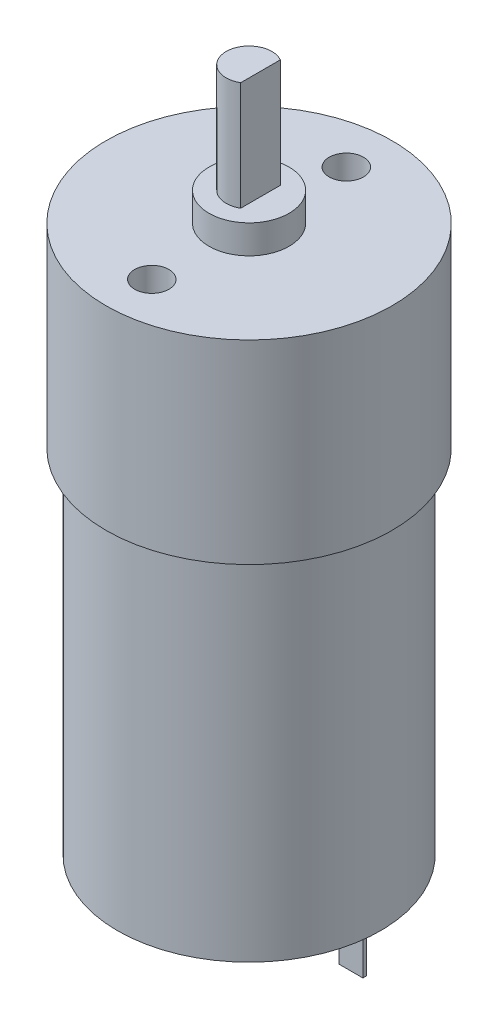
ISO-10303-21;
HEADER;
FILE_DESCRIPTION(('STEP AP214'),'2;1');
FILE_NAME('part.step','',(''),(''),'','','');
FILE_SCHEMA(('AUTOMOTIVE_DESIGN { 1 0 10303 214 1 1 1 1 }'));
ENDSEC;
DATA;
#1=APPLICATION_CONTEXT('core data for automotive mechanical design processes');
#2=APPLICATION_PROTOCOL_DEFINITION('international standard','automotive_design',2000,#1);
#3=PRODUCT_CONTEXT('',#1,'mechanical');
#4=PRODUCT('Part','Part','',(#3));
#5=PRODUCT_RELATED_PRODUCT_CATEGORY('part','',(#4));
#6=PRODUCT_DEFINITION_FORMATION('','',#4);
#7=PRODUCT_DEFINITION_CONTEXT('part definition',#1,'design');
#8=PRODUCT_DEFINITION('design','',#6,#7);
#9=PRODUCT_DEFINITION_SHAPE('','',#8);
#10=(LENGTH_UNIT() NAMED_UNIT(*) SI_UNIT(.MILLI.,.METRE.));
#11=(NAMED_UNIT(*) PLANE_ANGLE_UNIT() SI_UNIT($,.RADIAN.));
#12=(NAMED_UNIT(*) SI_UNIT($,.STERADIAN.) SOLID_ANGLE_UNIT());
#13=UNCERTAINTY_MEASURE_WITH_UNIT(LENGTH_MEASURE(1.E-05),#10,'distance_accuracy_value','');
#14=(GEOMETRIC_REPRESENTATION_CONTEXT(3) GLOBAL_UNCERTAINTY_ASSIGNED_CONTEXT((#13)) GLOBAL_UNIT_ASSIGNED_CONTEXT((#10,
#11,#12)) REPRESENTATION_CONTEXT('',''));
#15=CARTESIAN_POINT('',(0.,0.,0.));
#16=DIRECTION('',(0.,0.,1.));
#17=DIRECTION('',(1.,0.,0.));
#18=AXIS2_PLACEMENT_3D('',#15,#16,#17);
#19=CARTESIAN_POINT('',(0.,12.,0.));
#20=DIRECTION('',(0.,1.,0.));
#21=DIRECTION('',(0.,0.,1.));
#22=AXIS2_PLACEMENT_3D('',#19,#20,#21);
#23=PLANE('',#22);
#24=CARTESIAN_POINT('',(0.,12.,0.));
#25=DIRECTION('',(0.,1.,0.));
#26=DIRECTION('',(0.,0.,1.));
#27=AXIS2_PLACEMENT_3D('',#24,#25,#26);
#28=CIRCLE('',#27,2.);
#29=CARTESIAN_POINT('',(1.,12.,-1.73205080756888));
#30=VERTEX_POINT('',#29);
#31=CARTESIAN_POINT('',(1.,12.,1.73205080756888));
#32=VERTEX_POINT('',#31);
#33=EDGE_CURVE('E125',#30,#32,#28,.T.);
#34=ORIENTED_EDGE('',*,*,#33,.T.);
#35=DIRECTION('',(0.,0.,-1.));
#36=VECTOR('',#35,1.);
#37=CARTESIAN_POINT('',(1.,12.,0.));
#38=LINE('',#37,#36);
#39=EDGE_CURVE('E116',#32,#30,#38,.T.);
#40=ORIENTED_EDGE('',*,*,#39,.T.);
#41=EDGE_LOOP('',(#34,#40));
#42=FACE_BOUND('',#41,.T.);
#43=ADVANCED_FACE('F34',(#42),#23,.T.);
#44=CARTESIAN_POINT('',(0.,12.,0.));
#45=DIRECTION('',(0.,-1.,0.));
#46=DIRECTION('',(0.,0.,-1.));
#47=AXIS2_PLACEMENT_3D('',#44,#45,#46);
#48=CYLINDRICAL_SURFACE('',#47,2.);
#49=DIRECTION('',(0.,1.,0.));
#50=VECTOR('',#49,1.);
#51=CARTESIAN_POINT('',(1.,-1.10555127546399,1.73205080756888));
#52=LINE('',#51,#50);
#53=CARTESIAN_POINT('',(1.,2.5,1.73205080756888));
#54=VERTEX_POINT('',#53);
#55=EDGE_CURVE('E121',#54,#32,#52,.T.);
#56=ORIENTED_EDGE('',*,*,#55,.T.);
#57=ORIENTED_EDGE('',*,*,#33,.F.);
#58=DIRECTION('',(0.,1.,0.));
#59=VECTOR('',#58,1.);
#60=CARTESIAN_POINT('',(1.,-1.10555127546399,-1.73205080756888));
#61=LINE('',#60,#59);
#62=CARTESIAN_POINT('',(1.,2.5,-1.73205080756888));
#63=VERTEX_POINT('',#62);
#64=EDGE_CURVE('E113',#63,#30,#61,.T.);
#65=ORIENTED_EDGE('',*,*,#64,.F.);
#66=CARTESIAN_POINT('',(0.,2.5,0.));
#67=DIRECTION('',(0.,1.,0.));
#68=DIRECTION('',(0.,0.,1.));
#69=AXIS2_PLACEMENT_3D('',#66,#67,#68);
#70=CIRCLE('',#69,2.);
#71=EDGE_CURVE('E132',#63,#54,#70,.T.);
#72=ORIENTED_EDGE('',*,*,#71,.T.);
#73=EDGE_LOOP('',(#56,#57,#65,#72));
#74=FACE_BOUND('',#73,.T.);
#75=ADVANCED_FACE('F127',(#74),#48,.T.);
#76=CARTESIAN_POINT('',(0.,-47.8,0.));
#77=DIRECTION('',(0.,-1.,0.));
#78=DIRECTION('',(0.,0.,-1.));
#79=AXIS2_PLACEMENT_3D('',#76,#77,#78);
#80=PLANE('',#79);
#81=CARTESIAN_POINT('',(0.,-47.8,0.));
#82=DIRECTION('',(0.,-1.,0.));
#83=DIRECTION('',(0.,0.,-1.));
#84=AXIS2_PLACEMENT_3D('',#81,#82,#83);
#85=CIRCLE('',#84,11.5);
#86=CARTESIAN_POINT('',(0.,-47.8,11.5));
#87=VERTEX_POINT('',#86);
#88=EDGE_CURVE('E444',#87,#87,#85,.T.);
#89=ORIENTED_EDGE('',*,*,#88,.T.);
#90=EDGE_LOOP('',(#89));
#91=FACE_BOUND('',#90,.T.);
#92=DIRECTION('',(-1.,0.,0.));
#93=VECTOR('',#92,1.);
#94=CARTESIAN_POINT('',(-10.1,-47.8,0.15));
#95=LINE('',#94,#93);
#96=CARTESIAN_POINT('',(-8.,-47.8,0.15));
#97=VERTEX_POINT('',#96);
#98=CARTESIAN_POINT('',(-10.1,-47.8,0.15));
#99=VERTEX_POINT('',#98);
#100=EDGE_CURVE('E429',#97,#99,#95,.T.);
#101=ORIENTED_EDGE('',*,*,#100,.F.);
#102=DIRECTION('',(0.,0.,1.));
#103=VECTOR('',#102,1.);
#104=CARTESIAN_POINT('',(-8.,-47.8,-0.15));
#105=LINE('',#104,#103);
#106=CARTESIAN_POINT('',(-8.,-47.8,-0.15));
#107=VERTEX_POINT('',#106);
#108=EDGE_CURVE('E415',#107,#97,#105,.T.);
#109=ORIENTED_EDGE('',*,*,#108,.F.);
#110=DIRECTION('',(1.,0.,0.));
#111=VECTOR('',#110,1.);
#112=CARTESIAN_POINT('',(-10.1,-47.8,-0.15));
#113=LINE('',#112,#111);
#114=CARTESIAN_POINT('',(-10.1,-47.8,-0.15));
#115=VERTEX_POINT('',#114);
#116=EDGE_CURVE('E420',#115,#107,#113,.T.);
#117=ORIENTED_EDGE('',*,*,#116,.F.);
#118=DIRECTION('',(0.,0.,-1.));
#119=VECTOR('',#118,1.);
#120=CARTESIAN_POINT('',(-10.1,-47.8,-0.15));
#121=LINE('',#120,#119);
#122=EDGE_CURVE('E431',#99,#115,#121,.T.);
#123=ORIENTED_EDGE('',*,*,#122,.F.);
#124=EDGE_LOOP('',(#101,#109,#117,#123));
#125=FACE_BOUND('',#124,.T.);
#126=DIRECTION('',(-1.,0.,0.));
#127=VECTOR('',#126,1.);
#128=CARTESIAN_POINT('',(10.1,-47.8,0.15));
#129=LINE('',#128,#127);
#130=CARTESIAN_POINT('',(10.1,-47.8,0.15));
#131=VERTEX_POINT('',#130);
#132=CARTESIAN_POINT('',(8.,-47.8,0.15));
#133=VERTEX_POINT('',#132);
#134=EDGE_CURVE('E380',#131,#133,#129,.T.);
#135=ORIENTED_EDGE('',*,*,#134,.F.);
#136=DIRECTION('',(0.,0.,1.));
#137=VECTOR('',#136,1.);
#138=CARTESIAN_POINT('',(10.1,-47.8,-0.15));
#139=LINE('',#138,#137);
#140=CARTESIAN_POINT('',(10.1,-47.8,-0.15));
#141=VERTEX_POINT('',#140);
#142=EDGE_CURVE('E376',#141,#131,#139,.T.);
#143=ORIENTED_EDGE('',*,*,#142,.F.);
#144=DIRECTION('',(1.,0.,0.));
#145=VECTOR('',#144,1.);
#146=CARTESIAN_POINT('',(10.1,-47.8,-0.15));
#147=LINE('',#146,#145);
#148=CARTESIAN_POINT('',(8.,-47.8,-0.15));
#149=VERTEX_POINT('',#148);
#150=EDGE_CURVE('E396',#149,#141,#147,.T.);
#151=ORIENTED_EDGE('',*,*,#150,.F.);
#152=DIRECTION('',(0.,0.,-1.));
#153=VECTOR('',#152,1.);
#154=CARTESIAN_POINT('',(8.,-47.8,-0.15));
#155=LINE('',#154,#153);
#156=EDGE_CURVE('E404',#133,#149,#155,.T.);
#157=ORIENTED_EDGE('',*,*,#156,.F.);
#158=EDGE_LOOP('',(#135,#143,#151,#157));
#159=FACE_BOUND('',#158,.T.);
#160=ADVANCED_FACE('F152',(#91,#125,#159),#80,.T.);
#161=CARTESIAN_POINT('',(0.,-17.,0.));
#162=DIRECTION('',(0.,1.,0.));
#163=DIRECTION('',(0.,0.,1.));
#164=AXIS2_PLACEMENT_3D('',#161,#162,#163);
#165=CYLINDRICAL_SURFACE('',#164,12.5);
#166=CARTESIAN_POINT('',(0.,-17.,0.));
#167=DIRECTION('',(0.,1.,0.));
#168=DIRECTION('',(0.,0.,1.));
#169=AXIS2_PLACEMENT_3D('',#166,#167,#168);
#170=CIRCLE('',#169,12.5);
#171=CARTESIAN_POINT('',(0.,-17.,12.5));
#172=VERTEX_POINT('',#171);
#173=EDGE_CURVE('E43',#172,#172,#170,.T.);
#174=ORIENTED_EDGE('',*,*,#173,.T.);
#175=EDGE_LOOP('',(#174));
#176=FACE_BOUND('',#175,.T.);
#177=CARTESIAN_POINT('',(0.,0.,0.));
#178=DIRECTION('',(0.,1.,0.));
#179=DIRECTION('',(0.,0.,1.));
#180=AXIS2_PLACEMENT_3D('',#177,#178,#179);
#181=CIRCLE('',#180,12.5);
#182=CARTESIAN_POINT('',(0.,0.,12.5));
#183=VERTEX_POINT('',#182);
#184=EDGE_CURVE('E38',#183,#183,#181,.T.);
#185=ORIENTED_EDGE('',*,*,#184,.F.);
#186=EDGE_LOOP('',(#185));
#187=FACE_BOUND('',#186,.T.);
#188=ADVANCED_FACE('F36',(#176,#187),#165,.T.);
#189=CARTESIAN_POINT('',(0.,-17.,0.));
#190=DIRECTION('',(0.,1.,0.));
#191=DIRECTION('',(0.,0.,1.));
#192=AXIS2_PLACEMENT_3D('',#189,#190,#191);
#193=PLANE('',#192);
#194=CARTESIAN_POINT('',(0.,-17.,0.));
#195=DIRECTION('',(0.,-1.,0.));
#196=DIRECTION('',(0.,0.,-1.));
#197=AXIS2_PLACEMENT_3D('',#194,#195,#196);
#198=CIRCLE('',#197,11.5);
#199=CARTESIAN_POINT('',(0.,-17.,11.5));
#200=VERTEX_POINT('',#199);
#201=EDGE_CURVE('E11',#200,#200,#198,.T.);
#202=ORIENTED_EDGE('',*,*,#201,.F.);
#203=EDGE_LOOP('',(#202));
#204=FACE_BOUND('',#203,.T.);
#205=ORIENTED_EDGE('',*,*,#173,.F.);
#206=EDGE_LOOP('',(#205));
#207=FACE_BOUND('',#206,.T.);
#208=ADVANCED_FACE('F141',(#204,#207),#193,.F.);
#209=CARTESIAN_POINT('',(0.,0.,0.));
#210=DIRECTION('',(0.,1.,0.));
#211=DIRECTION('',(0.,0.,1.));
#212=AXIS2_PLACEMENT_3D('',#209,#210,#211);
#213=PLANE('',#212);
#214=CARTESIAN_POINT('',(0.,0.,8.5));
#215=DIRECTION('',(0.,1.,0.));
#216=DIRECTION('',(0.,0.,1.));
#217=AXIS2_PLACEMENT_3D('',#214,#215,#216);
#218=CIRCLE('',#217,1.5);
#219=CARTESIAN_POINT('',(0.,0.,10.));
#220=VERTEX_POINT('',#219);
#221=EDGE_CURVE('E377',#220,#220,#218,.T.);
#222=ORIENTED_EDGE('',*,*,#221,.F.);
#223=EDGE_LOOP('',(#222));
#224=FACE_BOUND('',#223,.T.);
#225=CARTESIAN_POINT('',(0.,0.,-8.5));
#226=DIRECTION('',(0.,1.,0.));
#227=DIRECTION('',(0.,0.,-1.));
#228=AXIS2_PLACEMENT_3D('',#225,#226,#227);
#229=CIRCLE('',#228,1.5);
#230=CARTESIAN_POINT('',(0.,0.,-10.));
#231=VERTEX_POINT('',#230);
#232=EDGE_CURVE('E389',#231,#231,#229,.T.);
#233=ORIENTED_EDGE('',*,*,#232,.F.);
#234=EDGE_LOOP('',(#233));
#235=FACE_BOUND('',#234,.T.);
#236=CARTESIAN_POINT('',(0.,0.,0.));
#237=DIRECTION('',(0.,1.,0.));
#238=DIRECTION('',(0.,0.,1.));
#239=AXIS2_PLACEMENT_3D('',#236,#237,#238);
#240=CIRCLE('',#239,3.5);
#241=CARTESIAN_POINT('',(0.,0.,3.5));
#242=VERTEX_POINT('',#241);
#243=EDGE_CURVE('E135',#242,#242,#240,.T.);
#244=ORIENTED_EDGE('',*,*,#243,.F.);
#245=EDGE_LOOP('',(#244));
#246=FACE_BOUND('',#245,.T.);
#247=ORIENTED_EDGE('',*,*,#184,.T.);
#248=EDGE_LOOP('',(#247));
#249=FACE_BOUND('',#248,.T.);
#250=ADVANCED_FACE('F143',(#224,#235,#246,#249),#213,.T.);
#251=CARTESIAN_POINT('',(0.,2.5,0.));
#252=DIRECTION('',(0.,-1.,0.));
#253=DIRECTION('',(0.,0.,-1.));
#254=AXIS2_PLACEMENT_3D('',#251,#252,#253);
#255=CYLINDRICAL_SURFACE('',#254,3.5);
#256=CARTESIAN_POINT('',(0.,2.5,0.));
#257=DIRECTION('',(0.,1.,0.));
#258=DIRECTION('',(0.,0.,1.));
#259=AXIS2_PLACEMENT_3D('',#256,#257,#258);
#260=CIRCLE('',#259,3.5);
#261=CARTESIAN_POINT('',(0.,2.5,3.5));
#262=VERTEX_POINT('',#261);
#263=EDGE_CURVE('E128',#262,#262,#260,.T.);
#264=ORIENTED_EDGE('',*,*,#263,.F.);
#265=EDGE_LOOP('',(#264));
#266=FACE_BOUND('',#265,.T.);
#267=ORIENTED_EDGE('',*,*,#243,.T.);
#268=EDGE_LOOP('',(#267));
#269=FACE_BOUND('',#268,.T.);
#270=ADVANCED_FACE('F150',(#266,#269),#255,.T.);
#271=CARTESIAN_POINT('',(0.,2.5,0.));
#272=DIRECTION('',(0.,1.,0.));
#273=DIRECTION('',(0.,0.,1.));
#274=AXIS2_PLACEMENT_3D('',#271,#272,#273);
#275=PLANE('',#274);
#276=ORIENTED_EDGE('',*,*,#71,.F.);
#277=DIRECTION('',(0.,0.,1.));
#278=VECTOR('',#277,1.);
#279=CARTESIAN_POINT('',(1.,2.5,0.));
#280=LINE('',#279,#278);
#281=EDGE_CURVE('E50',#63,#54,#280,.T.);
#282=ORIENTED_EDGE('',*,*,#281,.T.);
#283=EDGE_LOOP('',(#276,#282));
#284=FACE_BOUND('',#283,.T.);
#285=ORIENTED_EDGE('',*,*,#263,.T.);
#286=EDGE_LOOP('',(#285));
#287=FACE_BOUND('',#286,.T.);
#288=ADVANCED_FACE('F163',(#284,#287),#275,.T.);
#289=CARTESIAN_POINT('',(0.,-47.8,0.));
#290=DIRECTION('',(0.,1.,0.));
#291=DIRECTION('',(0.,0.,1.));
#292=AXIS2_PLACEMENT_3D('',#289,#290,#291);
#293=CYLINDRICAL_SURFACE('',#292,11.5);
#294=CARTESIAN_POINT('',(0.,-47.8,11.5));
#295=CARTESIAN_POINT('',(0.,-47.4791666666667,11.5));
#296=CARTESIAN_POINT('',(0.,-47.1583333333333,11.5));
#297=CARTESIAN_POINT('',(0.,-46.5166666666667,11.5));
#298=CARTESIAN_POINT('',(0.,-46.1958333333333,11.5));
#299=CARTESIAN_POINT('',(0.,-45.5541666666667,11.5));
#300=CARTESIAN_POINT('',(0.,-45.2333333333333,11.5));
#301=CARTESIAN_POINT('',(0.,-44.5916666666667,11.5));
#302=CARTESIAN_POINT('',(0.,-44.2708333333333,11.5));
#303=CARTESIAN_POINT('',(0.,-43.6291666666667,11.5));
#304=CARTESIAN_POINT('',(0.,-43.3083333333333,11.5));
#305=CARTESIAN_POINT('',(0.,-42.6666666666667,11.5));
#306=CARTESIAN_POINT('',(0.,-42.3458333333333,11.5));
#307=CARTESIAN_POINT('',(0.,-41.7041666666667,11.5));
#308=CARTESIAN_POINT('',(0.,-41.3833333333333,11.5));
#309=CARTESIAN_POINT('',(0.,-40.7416666666667,11.5));
#310=CARTESIAN_POINT('',(0.,-40.4208333333333,11.5));
#311=CARTESIAN_POINT('',(0.,-39.7791666666667,11.5));
#312=CARTESIAN_POINT('',(0.,-39.4583333333333,11.5));
#313=CARTESIAN_POINT('',(0.,-38.8166666666667,11.5));
#314=CARTESIAN_POINT('',(0.,-38.4958333333333,11.5));
#315=CARTESIAN_POINT('',(0.,-37.8541666666667,11.5));
#316=CARTESIAN_POINT('',(0.,-37.5333333333333,11.5));
#317=CARTESIAN_POINT('',(0.,-36.8916666666667,11.5));
#318=CARTESIAN_POINT('',(0.,-36.5708333333333,11.5));
#319=CARTESIAN_POINT('',(0.,-35.9291666666667,11.5));
#320=CARTESIAN_POINT('',(0.,-35.6083333333333,11.5));
#321=CARTESIAN_POINT('',(0.,-34.9666666666667,11.5));
#322=CARTESIAN_POINT('',(0.,-34.6458333333333,11.5));
#323=CARTESIAN_POINT('',(0.,-34.0041666666667,11.5));
#324=CARTESIAN_POINT('',(0.,-33.6833333333333,11.5));
#325=CARTESIAN_POINT('',(0.,-33.0416666666667,11.5));
#326=CARTESIAN_POINT('',(0.,-32.7208333333333,11.5));
#327=CARTESIAN_POINT('',(0.,-32.0791666666667,11.5));
#328=CARTESIAN_POINT('',(0.,-31.7583333333333,11.5));
#329=CARTESIAN_POINT('',(0.,-31.1166666666667,11.5));
#330=CARTESIAN_POINT('',(0.,-30.7958333333333,11.5));
#331=CARTESIAN_POINT('',(0.,-30.1541666666667,11.5));
#332=CARTESIAN_POINT('',(0.,-29.8333333333333,11.5));
#333=CARTESIAN_POINT('',(0.,-29.1916666666667,11.5));
#334=CARTESIAN_POINT('',(0.,-28.8708333333333,11.5));
#335=CARTESIAN_POINT('',(0.,-28.2291666666667,11.5));
#336=CARTESIAN_POINT('',(0.,-27.9083333333333,11.5));
#337=CARTESIAN_POINT('',(0.,-27.2666666666667,11.5));
#338=CARTESIAN_POINT('',(0.,-26.9458333333333,11.5));
#339=CARTESIAN_POINT('',(0.,-26.3041666666667,11.5));
#340=CARTESIAN_POINT('',(0.,-25.9833333333333,11.5));
#341=CARTESIAN_POINT('',(0.,-25.3416666666667,11.5));
#342=CARTESIAN_POINT('',(0.,-25.0208333333333,11.5));
#343=CARTESIAN_POINT('',(0.,-24.3791666666667,11.5));
#344=CARTESIAN_POINT('',(0.,-24.0583333333333,11.5));
#345=CARTESIAN_POINT('',(0.,-23.4166666666667,11.5));
#346=CARTESIAN_POINT('',(0.,-23.0958333333333,11.5));
#347=CARTESIAN_POINT('',(0.,-22.4541666666667,11.5));
#348=CARTESIAN_POINT('',(0.,-22.1333333333333,11.5));
#349=CARTESIAN_POINT('',(0.,-21.4916666666667,11.5));
#350=CARTESIAN_POINT('',(0.,-21.1708333333333,11.5));
#351=CARTESIAN_POINT('',(0.,-20.5291666666667,11.5));
#352=CARTESIAN_POINT('',(0.,-20.2083333333333,11.5));
#353=CARTESIAN_POINT('',(0.,-19.5666666666667,11.5));
#354=CARTESIAN_POINT('',(0.,-19.2458333333333,11.5));
#355=CARTESIAN_POINT('',(0.,-18.6041666666667,11.5));
#356=CARTESIAN_POINT('',(0.,-18.2833333333333,11.5));
#357=CARTESIAN_POINT('',(0.,-17.6416666666667,11.5));
#358=CARTESIAN_POINT('',(0.,-17.3208333333333,11.5));
#359=CARTESIAN_POINT('',(0.,-17.,11.5));
#360=B_SPLINE_CURVE_WITH_KNOTS('',3,(#294,#295,#296,#297,#298,#299,#300,#301,#302,#303,#304,
#305,#306,#307,#308,#309,#310,#311,#312,#313,#314,#315,#316,#317,#318,#319,#320,#321,#322,#323,
#324,#325,#326,#327,#328,#329,#330,#331,#332,#333,#334,#335,#336,#337,#338,#339,#340,#341,#342,
#343,#344,#345,#346,#347,#348,#349,#350,#351,#352,#353,#354,#355,#356,#357,#358,#359),
.UNSPECIFIED.,.F.,.F.,(4,2,2,2,2,2,2,2,2,2,2,2,2,2,2,2,2,2,2,2,2,2,2,2,2,2,2,2,2,2,2,2,4),(0.,
0.962500000000005,1.925,2.8875,3.85000000000001,4.8125,5.775,6.7375,7.70000000000001,8.6625,
9.625,10.5875,11.55,12.5125,13.475,14.4375,15.4,16.3625,17.325,18.2875,19.25,20.2125,21.175,
22.1375,23.1,24.0625,25.025,25.9875,26.95,27.9125,28.875,29.8375,30.8),.UNSPECIFIED.);
#361=EDGE_CURVE('BSEAM167',#87,#200,#360,.T.);
#362=ORIENTED_EDGE('',*,*,#88,.F.);
#363=ORIENTED_EDGE('',*,*,#201,.T.);
#364=ORIENTED_EDGE('',*,*,#361,.T.);
#365=ORIENTED_EDGE('',*,*,#361,.F.);
#366=EDGE_LOOP('',(#362,#364,#363,#365));
#367=FACE_BOUND('',#366,.T.);
#368=ADVANCED_FACE('F167',(#367),#293,.T.);
#369=CARTESIAN_POINT('',(-8.,-52.,-0.15));
#370=DIRECTION('',(-1.,0.,0.));
#371=DIRECTION('',(0.,0.,1.));
#372=AXIS2_PLACEMENT_3D('',#369,#370,#371);
#373=PLANE('',#372);
#374=ORIENTED_EDGE('',*,*,#108,.T.);
#375=DIRECTION('',(0.,1.,0.));
#376=VECTOR('',#375,1.);
#377=CARTESIAN_POINT('',(-8.,-52.,0.15));
#378=LINE('',#377,#376);
#379=CARTESIAN_POINT('',(-8.,-52.,0.15));
#380=VERTEX_POINT('',#379);
#381=EDGE_CURVE('E442',#380,#97,#378,.T.);
#382=ORIENTED_EDGE('',*,*,#381,.F.);
#383=DIRECTION('',(0.,0.,1.));
#384=VECTOR('',#383,1.);
#385=CARTESIAN_POINT('',(-8.,-52.,-0.15));
#386=LINE('',#385,#384);
#387=CARTESIAN_POINT('',(-8.,-52.,-0.15));
#388=VERTEX_POINT('',#387);
#389=EDGE_CURVE('E416',#388,#380,#386,.T.);
#390=ORIENTED_EDGE('',*,*,#389,.F.);
#391=DIRECTION('',(0.,1.,0.));
#392=VECTOR('',#391,1.);
#393=CARTESIAN_POINT('',(-8.,-52.,-0.15));
#394=LINE('',#393,#392);
#395=EDGE_CURVE('E426',#388,#107,#394,.T.);
#396=ORIENTED_EDGE('',*,*,#395,.T.);
#397=EDGE_LOOP('',(#374,#382,#390,#396));
#398=FACE_BOUND('',#397,.T.);
#399=ADVANCED_FACE('F170',(#398),#373,.F.);
#400=CARTESIAN_POINT('',(-10.1,-52.,0.15));
#401=DIRECTION('',(0.,0.,-1.));
#402=DIRECTION('',(-1.,0.,0.));
#403=AXIS2_PLACEMENT_3D('',#400,#401,#402);
#404=PLANE('',#403);
#405=ORIENTED_EDGE('',*,*,#100,.T.);
#406=DIRECTION('',(0.,1.,0.));
#407=VECTOR('',#406,1.);
#408=CARTESIAN_POINT('',(-10.1,-52.,0.15));
#409=LINE('',#408,#407);
#410=CARTESIAN_POINT('',(-10.1,-52.,0.15));
#411=VERTEX_POINT('',#410);
#412=EDGE_CURVE('E439',#411,#99,#409,.T.);
#413=ORIENTED_EDGE('',*,*,#412,.F.);
#414=DIRECTION('',(-1.,0.,0.));
#415=VECTOR('',#414,1.);
#416=CARTESIAN_POINT('',(-10.1,-52.,0.15));
#417=LINE('',#416,#415);
#418=EDGE_CURVE('E419',#380,#411,#417,.T.);
#419=ORIENTED_EDGE('',*,*,#418,.F.);
#420=ORIENTED_EDGE('',*,*,#381,.T.);
#421=EDGE_LOOP('',(#405,#413,#419,#420));
#422=FACE_BOUND('',#421,.T.);
#423=ADVANCED_FACE('F177',(#422),#404,.F.);
#424=CARTESIAN_POINT('',(-10.1,-52.,-0.15));
#425=DIRECTION('',(1.,0.,0.));
#426=DIRECTION('',(0.,0.,-1.));
#427=AXIS2_PLACEMENT_3D('',#424,#425,#426);
#428=PLANE('',#427);
#429=ORIENTED_EDGE('',*,*,#122,.T.);
#430=DIRECTION('',(0.,1.,0.));
#431=VECTOR('',#430,1.);
#432=CARTESIAN_POINT('',(-10.1,-52.,-0.15));
#433=LINE('',#432,#431);
#434=CARTESIAN_POINT('',(-10.1,-52.,-0.15));
#435=VERTEX_POINT('',#434);
#436=EDGE_CURVE('E437',#435,#115,#433,.T.);
#437=ORIENTED_EDGE('',*,*,#436,.F.);
#438=DIRECTION('',(0.,0.,-1.));
#439=VECTOR('',#438,1.);
#440=CARTESIAN_POINT('',(-10.1,-52.,-0.15));
#441=LINE('',#440,#439);
#442=EDGE_CURVE('E422',#411,#435,#441,.T.);
#443=ORIENTED_EDGE('',*,*,#442,.F.);
#444=ORIENTED_EDGE('',*,*,#412,.T.);
#445=EDGE_LOOP('',(#429,#437,#443,#444));
#446=FACE_BOUND('',#445,.T.);
#447=ADVANCED_FACE('F181',(#446),#428,.F.);
#448=CARTESIAN_POINT('',(-10.1,-52.,-0.15));
#449=DIRECTION('',(0.,0.,1.));
#450=DIRECTION('',(1.,0.,0.));
#451=AXIS2_PLACEMENT_3D('',#448,#449,#450);
#452=PLANE('',#451);
#453=ORIENTED_EDGE('',*,*,#116,.T.);
#454=ORIENTED_EDGE('',*,*,#395,.F.);
#455=DIRECTION('',(1.,0.,0.));
#456=VECTOR('',#455,1.);
#457=CARTESIAN_POINT('',(-10.1,-52.,-0.15));
#458=LINE('',#457,#456);
#459=EDGE_CURVE('E424',#435,#388,#458,.T.);
#460=ORIENTED_EDGE('',*,*,#459,.F.);
#461=ORIENTED_EDGE('',*,*,#436,.T.);
#462=EDGE_LOOP('',(#453,#454,#460,#461));
#463=FACE_BOUND('',#462,.T.);
#464=ADVANCED_FACE('F185',(#463),#452,.F.);
#465=CARTESIAN_POINT('',(0.,-52.,0.));
#466=DIRECTION('',(0.,1.,0.));
#467=DIRECTION('',(0.,0.,1.));
#468=AXIS2_PLACEMENT_3D('',#465,#466,#467);
#469=PLANE('',#468);
#470=ORIENTED_EDGE('',*,*,#389,.T.);
#471=ORIENTED_EDGE('',*,*,#418,.T.);
#472=ORIENTED_EDGE('',*,*,#442,.T.);
#473=ORIENTED_EDGE('',*,*,#459,.T.);
#474=EDGE_LOOP('',(#470,#471,#472,#473));
#475=FACE_BOUND('',#474,.T.);
#476=ADVANCED_FACE('F189',(#475),#469,.F.);
#477=CARTESIAN_POINT('',(10.1,-52.,-0.15));
#478=DIRECTION('',(-1.,0.,0.));
#479=DIRECTION('',(0.,0.,1.));
#480=AXIS2_PLACEMENT_3D('',#477,#478,#479);
#481=PLANE('',#480);
#482=ORIENTED_EDGE('',*,*,#142,.T.);
#483=DIRECTION('',(0.,1.,0.));
#484=VECTOR('',#483,1.);
#485=CARTESIAN_POINT('',(10.1,-52.,0.15));
#486=LINE('',#485,#484);
#487=CARTESIAN_POINT('',(10.1,-52.,0.15));
#488=VERTEX_POINT('',#487);
#489=EDGE_CURVE('E413',#488,#131,#486,.T.);
#490=ORIENTED_EDGE('',*,*,#489,.F.);
#491=DIRECTION('',(0.,0.,1.));
#492=VECTOR('',#491,1.);
#493=CARTESIAN_POINT('',(10.1,-52.,-0.15));
#494=LINE('',#493,#492);
#495=CARTESIAN_POINT('',(10.1,-52.,-0.15));
#496=VERTEX_POINT('',#495);
#497=EDGE_CURVE('E392',#496,#488,#494,.T.);
#498=ORIENTED_EDGE('',*,*,#497,.F.);
#499=DIRECTION('',(0.,1.,0.));
#500=VECTOR('',#499,1.);
#501=CARTESIAN_POINT('',(10.1,-52.,-0.15));
#502=LINE('',#501,#500);
#503=EDGE_CURVE('E401',#496,#141,#502,.T.);
#504=ORIENTED_EDGE('',*,*,#503,.T.);
#505=EDGE_LOOP('',(#482,#490,#498,#504));
#506=FACE_BOUND('',#505,.T.);
#507=ADVANCED_FACE('F193',(#506),#481,.F.);
#508=CARTESIAN_POINT('',(10.1,-52.,0.15));
#509=DIRECTION('',(0.,0.,-1.));
#510=DIRECTION('',(-1.,0.,0.));
#511=AXIS2_PLACEMENT_3D('',#508,#509,#510);
#512=PLANE('',#511);
#513=ORIENTED_EDGE('',*,*,#134,.T.);
#514=DIRECTION('',(0.,1.,0.));
#515=VECTOR('',#514,1.);
#516=CARTESIAN_POINT('',(8.,-52.,0.15));
#517=LINE('',#516,#515);
#518=CARTESIAN_POINT('',(8.,-52.,0.15));
#519=VERTEX_POINT('',#518);
#520=EDGE_CURVE('E410',#519,#133,#517,.T.);
#521=ORIENTED_EDGE('',*,*,#520,.F.);
#522=DIRECTION('',(-1.,0.,0.));
#523=VECTOR('',#522,1.);
#524=CARTESIAN_POINT('',(10.1,-52.,0.15));
#525=LINE('',#524,#523);
#526=EDGE_CURVE('E395',#488,#519,#525,.T.);
#527=ORIENTED_EDGE('',*,*,#526,.F.);
#528=ORIENTED_EDGE('',*,*,#489,.T.);
#529=EDGE_LOOP('',(#513,#521,#527,#528));
#530=FACE_BOUND('',#529,.T.);
#531=ADVANCED_FACE('F197',(#530),#512,.F.);
#532=CARTESIAN_POINT('',(8.,-52.,-0.15));
#533=DIRECTION('',(1.,0.,0.));
#534=DIRECTION('',(0.,0.,-1.));
#535=AXIS2_PLACEMENT_3D('',#532,#533,#534);
#536=PLANE('',#535);
#537=ORIENTED_EDGE('',*,*,#156,.T.);
#538=DIRECTION('',(0.,1.,0.));
#539=VECTOR('',#538,1.);
#540=CARTESIAN_POINT('',(8.,-52.,-0.15));
#541=LINE('',#540,#539);
#542=CARTESIAN_POINT('',(8.,-52.,-0.15));
#543=VERTEX_POINT('',#542);
#544=EDGE_CURVE('E58',#543,#149,#541,.T.);
#545=ORIENTED_EDGE('',*,*,#544,.F.);
#546=DIRECTION('',(0.,0.,-1.));
#547=VECTOR('',#546,1.);
#548=CARTESIAN_POINT('',(8.,-52.,-0.15));
#549=LINE('',#548,#547);
#550=EDGE_CURVE('E398',#519,#543,#549,.T.);
#551=ORIENTED_EDGE('',*,*,#550,.F.);
#552=ORIENTED_EDGE('',*,*,#520,.T.);
#553=EDGE_LOOP('',(#537,#545,#551,#552));
#554=FACE_BOUND('',#553,.T.);
#555=ADVANCED_FACE('F201',(#554),#536,.F.);
#556=CARTESIAN_POINT('',(10.1,-52.,-0.15));
#557=DIRECTION('',(0.,0.,1.));
#558=DIRECTION('',(1.,0.,0.));
#559=AXIS2_PLACEMENT_3D('',#556,#557,#558);
#560=PLANE('',#559);
#561=ORIENTED_EDGE('',*,*,#150,.T.);
#562=ORIENTED_EDGE('',*,*,#503,.F.);
#563=DIRECTION('',(1.,0.,0.));
#564=VECTOR('',#563,1.);
#565=CARTESIAN_POINT('',(10.1,-52.,-0.15));
#566=LINE('',#565,#564);
#567=EDGE_CURVE('E400',#543,#496,#566,.T.);
#568=ORIENTED_EDGE('',*,*,#567,.F.);
#569=ORIENTED_EDGE('',*,*,#544,.T.);
#570=EDGE_LOOP('',(#561,#562,#568,#569));
#571=FACE_BOUND('',#570,.T.);
#572=ADVANCED_FACE('F205',(#571),#560,.F.);
#573=CARTESIAN_POINT('',(0.,-52.,0.));
#574=DIRECTION('',(0.,-1.,0.));
#575=DIRECTION('',(0.,0.,-1.));
#576=AXIS2_PLACEMENT_3D('',#573,#574,#575);
#577=PLANE('',#576);
#578=ORIENTED_EDGE('',*,*,#497,.T.);
#579=ORIENTED_EDGE('',*,*,#526,.T.);
#580=ORIENTED_EDGE('',*,*,#550,.T.);
#581=ORIENTED_EDGE('',*,*,#567,.T.);
#582=EDGE_LOOP('',(#578,#579,#580,#581));
#583=FACE_BOUND('',#582,.T.);
#584=ADVANCED_FACE('F209',(#583),#577,.T.);
#585=CARTESIAN_POINT('',(0.,-5.,-8.5));
#586=DIRECTION('',(0.,1.,0.));
#587=DIRECTION('',(0.,0.,1.));
#588=AXIS2_PLACEMENT_3D('',#585,#586,#587);
#589=CYLINDRICAL_SURFACE('',#588,1.5);
#590=CARTESIAN_POINT('',(0.,-5.,-8.5));
#591=DIRECTION('',(0.,1.,0.));
#592=DIRECTION('',(0.,0.,-1.));
#593=AXIS2_PLACEMENT_3D('',#590,#591,#592);
#594=CIRCLE('',#593,1.5);
#595=CARTESIAN_POINT('',(0.,-5.,-10.));
#596=VERTEX_POINT('',#595);
#597=EDGE_CURVE('E383',#596,#596,#594,.T.);
#598=ORIENTED_EDGE('',*,*,#597,.F.);
#599=EDGE_LOOP('',(#598));
#600=FACE_BOUND('',#599,.T.);
#601=ORIENTED_EDGE('',*,*,#232,.T.);
#602=EDGE_LOOP('',(#601));
#603=FACE_BOUND('',#602,.T.);
#604=ADVANCED_FACE('F212',(#600,#603),#589,.F.);
#605=CARTESIAN_POINT('',(0.,-5.,-8.5));
#606=DIRECTION('',(0.,-1.,0.));
#607=DIRECTION('',(0.,0.,-1.));
#608=AXIS2_PLACEMENT_3D('',#605,#606,#607);
#609=PLANE('',#608);
#610=ORIENTED_EDGE('',*,*,#597,.T.);
#611=EDGE_LOOP('',(#610));
#612=FACE_BOUND('',#611,.T.);
#613=ADVANCED_FACE('F216',(#612),#609,.F.);
#614=CARTESIAN_POINT('',(0.,-5.,8.5));
#615=DIRECTION('',(0.,1.,0.));
#616=DIRECTION('',(0.,0.,1.));
#617=AXIS2_PLACEMENT_3D('',#614,#615,#616);
#618=CYLINDRICAL_SURFACE('',#617,1.5);
#619=CARTESIAN_POINT('',(0.,-5.,8.5));
#620=DIRECTION('',(0.,1.,0.));
#621=DIRECTION('',(0.,0.,1.));
#622=AXIS2_PLACEMENT_3D('',#619,#620,#621);
#623=CIRCLE('',#622,1.5);
#624=CARTESIAN_POINT('',(0.,-5.,10.));
#625=VERTEX_POINT('',#624);
#626=EDGE_CURVE('E375',#625,#625,#623,.T.);
#627=ORIENTED_EDGE('',*,*,#626,.F.);
#628=EDGE_LOOP('',(#627));
#629=FACE_BOUND('',#628,.T.);
#630=ORIENTED_EDGE('',*,*,#221,.T.);
#631=EDGE_LOOP('',(#630));
#632=FACE_BOUND('',#631,.T.);
#633=ADVANCED_FACE('F220',(#629,#632),#618,.F.);
#634=CARTESIAN_POINT('',(0.,-5.,8.5));
#635=DIRECTION('',(0.,1.,0.));
#636=DIRECTION('',(0.,0.,1.));
#637=AXIS2_PLACEMENT_3D('',#634,#635,#636);
#638=PLANE('',#637);
#639=ORIENTED_EDGE('',*,*,#626,.T.);
#640=EDGE_LOOP('',(#639));
#641=FACE_BOUND('',#640,.T.);
#642=ADVANCED_FACE('F224',(#641),#638,.T.);
#643=CARTESIAN_POINT('',(1.,-1.10555127546399,0.));
#644=DIRECTION('',(1.,0.,0.));
#645=DIRECTION('',(0.,0.,-1.));
#646=AXIS2_PLACEMENT_3D('',#643,#644,#645);
#647=PLANE('',#646);
#648=ORIENTED_EDGE('',*,*,#64,.T.);
#649=ORIENTED_EDGE('',*,*,#39,.F.);
#650=ORIENTED_EDGE('',*,*,#55,.F.);
#651=ORIENTED_EDGE('',*,*,#281,.F.);
#652=EDGE_LOOP('',(#648,#649,#650,#651));
#653=FACE_BOUND('',#652,.T.);
#654=ADVANCED_FACE('F115',(#653),#647,.T.);
#655=CLOSED_SHELL('',(#43,#75,#160,#188,#208,#250,#270,#288,#368,#399,#423,#447,#464,#476,#507,
#531,#555,#572,#584,#604,#613,#633,#642,#654));
#656=MANIFOLD_SOLID_BREP('B2',#655);
#657=ADVANCED_BREP_SHAPE_REPRESENTATION('',(#18,#656),#14);
#658=SHAPE_DEFINITION_REPRESENTATION(#9,#657);
ENDSEC;
END-ISO-10303-21;
